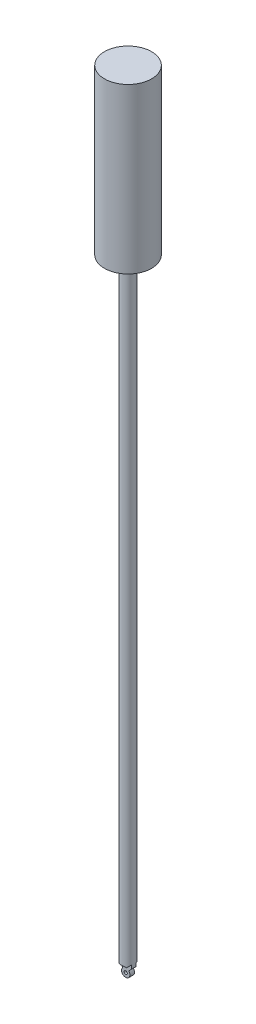
ISO-10303-21;
HEADER;
FILE_DESCRIPTION(('STEP AP214'),'2;1');
FILE_NAME('part.step','',(''),(''),'','','');
FILE_SCHEMA(('AUTOMOTIVE_DESIGN { 1 0 10303 214 1 1 1 1 }'));
ENDSEC;
DATA;
#1=APPLICATION_CONTEXT('core data for automotive mechanical design processes');
#2=APPLICATION_PROTOCOL_DEFINITION('international standard','automotive_design',2000,#1);
#3=PRODUCT_CONTEXT('',#1,'mechanical');
#4=PRODUCT('Part','Part','',(#3));
#5=PRODUCT_RELATED_PRODUCT_CATEGORY('part','',(#4));
#6=PRODUCT_DEFINITION_FORMATION('','',#4);
#7=PRODUCT_DEFINITION_CONTEXT('part definition',#1,'design');
#8=PRODUCT_DEFINITION('design','',#6,#7);
#9=PRODUCT_DEFINITION_SHAPE('','',#8);
#10=(LENGTH_UNIT() NAMED_UNIT(*) SI_UNIT(.MILLI.,.METRE.));
#11=(NAMED_UNIT(*) PLANE_ANGLE_UNIT() SI_UNIT($,.RADIAN.));
#12=(NAMED_UNIT(*) SI_UNIT($,.STERADIAN.) SOLID_ANGLE_UNIT());
#13=UNCERTAINTY_MEASURE_WITH_UNIT(LENGTH_MEASURE(1.E-05),#10,'distance_accuracy_value','');
#14=(GEOMETRIC_REPRESENTATION_CONTEXT(3) GLOBAL_UNCERTAINTY_ASSIGNED_CONTEXT((#13)) GLOBAL_UNIT_ASSIGNED_CONTEXT((#10,
#11,#12)) REPRESENTATION_CONTEXT('',''));
#15=CARTESIAN_POINT('',(0.,0.,0.));
#16=DIRECTION('',(0.,0.,1.));
#17=DIRECTION('',(1.,0.,0.));
#18=AXIS2_PLACEMENT_3D('',#15,#16,#17);
#19=CARTESIAN_POINT('',(0.,-20.,0.));
#20=DIRECTION('',(0.,1.,0.));
#21=DIRECTION('',(-1.,0.,0.));
#22=AXIS2_PLACEMENT_3D('',#19,#20,#21);
#23=CYLINDRICAL_SURFACE('',#22,4.);
#24=CARTESIAN_POINT('',(0.,-17.6666686049084,0.));
#25=DIRECTION('',(0.707106781186582,0.707106781186513,0.));
#26=DIRECTION('',(-0.707106781186513,0.707106781186582,0.));
#27=AXIS2_PLACEMENT_3D('',#24,#25,#26);
#28=ELLIPSE('',#27,5.65685424949266,4.);
#29=CARTESIAN_POINT('',(-3.72141018671348,-13.9452584181946,-1.466665));
#30=VERTEX_POINT('',#29);
#31=CARTESIAN_POINT('',(-2.35755264134601,-15.3091159635622,-3.23139993552057));
#32=VERTEX_POINT('',#31);
#33=EDGE_CURVE('E11',#30,#32,#28,.F.);
#34=ORIENTED_EDGE('',*,*,#33,.F.);
#35=DIRECTION('',(0.,1.,0.));
#36=VECTOR('',#35,1.);
#37=CARTESIAN_POINT('',(-3.72141018671347,-20.,-1.466665));
#38=LINE('',#37,#36);
#39=CARTESIAN_POINT('',(-3.72141018671345,-16.2785894181945,-1.466665));
#40=VERTEX_POINT('',#39);
#41=EDGE_CURVE('E130',#30,#40,#38,.F.);
#42=ORIENTED_EDGE('',*,*,#41,.T.);
#43=CARTESIAN_POINT('',(0.,-19.999999604908,0.));
#44=DIRECTION('',(0.707106781186548,0.707106781186547,0.));
#45=DIRECTION('',(-0.707106781186547,0.707106781186548,0.));
#46=AXIS2_PLACEMENT_3D('',#43,#44,#45);
#47=ELLIPSE('',#46,5.65685424949239,4.);
#48=CARTESIAN_POINT('',(-3.72141018671347,-16.2785894181945,1.466665));
#49=VERTEX_POINT('',#48);
#50=EDGE_CURVE('E177',#49,#40,#47,.F.);
#51=ORIENTED_EDGE('',*,*,#50,.F.);
#52=DIRECTION('',(0.,1.,0.));
#53=VECTOR('',#52,1.);
#54=CARTESIAN_POINT('',(-3.72141018671347,-20.,1.466665));
#55=LINE('',#54,#53);
#56=CARTESIAN_POINT('',(-3.72141018671348,-13.9452584181946,1.466665));
#57=VERTEX_POINT('',#56);
#58=EDGE_CURVE('E49',#49,#57,#55,.T.);
#59=ORIENTED_EDGE('',*,*,#58,.T.);
#60=CARTESIAN_POINT('',(0.,-17.6666686049084,0.));
#61=DIRECTION('',(-0.707106781186582,-0.707106781186513,0.));
#62=DIRECTION('',(-0.707106781186513,0.707106781186582,0.));
#63=AXIS2_PLACEMENT_3D('',#60,#61,#62);
#64=ELLIPSE('',#63,5.65685424949266,4.);
#65=CARTESIAN_POINT('',(-2.35755264134601,-15.3091159635622,3.23139993552057));
#66=VERTEX_POINT('',#65);
#67=EDGE_CURVE('E185',#57,#66,#64,.F.);
#68=ORIENTED_EDGE('',*,*,#67,.T.);
#69=CARTESIAN_POINT('',(-2.35755264134601,-15.3091159635622,3.23139993552057));
#70=CARTESIAN_POINT('',(-2.28018477029187,-15.2702245522524,3.2878467518568));
#71=CARTESIAN_POINT('',(-2.20037255193903,-15.2325178433075,3.34181663122735));
#72=CARTESIAN_POINT('',(-2.03601236884009,-15.1600458296973,3.44442259321851));
#73=CARTESIAN_POINT('',(-1.95146027702996,-15.1252831566858,3.49305391500256));
#74=CARTESIAN_POINT('',(-1.77735990259457,-15.0591327826377,3.58479183254059));
#75=CARTESIAN_POINT('',(-1.68778330091307,-15.0277679169173,3.62786138128199));
#76=CARTESIAN_POINT('',(-1.50451563254694,-14.9692816422629,3.70761593930542));
#77=CARTESIAN_POINT('',(-1.41082564137398,-14.9421591324599,3.74430260519047));
#78=CARTESIAN_POINT('',(-1.21923701871661,-14.8925784155484,3.81101146719209));
#79=CARTESIAN_POINT('',(-1.12131690671836,-14.870148528965,3.84099326949131));
#80=CARTESIAN_POINT('',(-0.92244737243638,-14.8306856032384,3.89354146584116));
#81=CARTESIAN_POINT('',(-0.821498324494044,-14.8136519001724,3.91610877215157));
#82=CARTESIAN_POINT('',(-0.617684054783718,-14.7854565902768,3.95337368822952));
#83=CARTESIAN_POINT('',(-0.514825986121909,-14.7742763949892,3.96809621263827));
#84=CARTESIAN_POINT('',(-0.307803756713248,-14.7580079847133,3.98949640744376));
#85=CARTESIAN_POINT('',(-0.203639773324103,-14.752918951343,3.99617515856764));
#86=CARTESIAN_POINT('',(-0.00595540862767157,-14.7491775055303,4.00108618841533));
#87=CARTESIAN_POINT('',(0.0875343906052204,-14.7499054728652,4.00013155816628));
#88=CARTESIAN_POINT('',(0.274077986535251,-14.7563332143547,3.99169154357499));
#89=CARTESIAN_POINT('',(0.367131631449622,-14.7620346063419,3.98420403411657));
#90=CARTESIAN_POINT('',(0.552114801363084,-14.7782915939085,3.96280710190654));
#91=CARTESIAN_POINT('',(0.64404376015586,-14.7888495389203,3.94889457093891));
#92=CARTESIAN_POINT('',(0.826099627047839,-14.8145900474948,3.91486270094267));
#93=CARTESIAN_POINT('',(0.916225848177409,-14.8297743395436,3.89474104203686));
#94=CARTESIAN_POINT('',(1.17815623347757,-14.8808814825838,3.82672517404508));
#95=CARTESIAN_POINT('',(1.34671694593059,-14.9228473316024,3.77054859065809));
#96=CARTESIAN_POINT('',(1.67145657144918,-15.020293387619,3.63827240859034));
#97=CARTESIAN_POINT('',(1.8276380908952,-15.0757707397624,3.56217701831415));
#98=CARTESIAN_POINT('',(2.04310281497984,-15.1633343512534,3.43970624959556));
#99=CARTESIAN_POINT('',(2.10811602300689,-15.1913438616972,3.40023310316015));
#100=CARTESIAN_POINT('',(2.23508626926058,-15.2490335564896,3.31814422581291));
#101=CARTESIAN_POINT('',(2.29705079327871,-15.2787092216106,3.27553690689552));
#102=CARTESIAN_POINT('',(2.35755264134573,-15.309115963562,3.23139993552081));
#103=B_SPLINE_CURVE_WITH_KNOTS('',3,(#69,#70,#71,#72,#73,#74,#75,#76,#77,#78,#79,#80,#81,#82,
#83,#84,#85,#86,#87,#88,#89,#90,#91,#92,#93,#94,#95,#96,#97,#98,#99,#100,#101,#102),
.UNSPECIFIED.,.F.,.F.,(4,2,2,2,2,2,2,2,2,2,2,2,2,2,2,2,4),(0.,0.310080225500508,
0.620434766677422,0.932760264622766,1.24500458080203,1.5590821791133,1.87312111967167,
2.18615665181655,2.4991501211466,2.77928617866823,3.05951339717674,3.33987632271977,
3.62034412558001,4.16567717972672,4.71089510989294,4.95394024821133,5.19635532519679),.UNSPECIFIED.);
#104=CARTESIAN_POINT('',(2.35755264134573,-15.309115963562,3.23139993552081));
#105=VERTEX_POINT('',#104);
#106=EDGE_CURVE('E57',#66,#105,#103,.T.);
#107=ORIENTED_EDGE('',*,*,#106,.T.);
#108=CARTESIAN_POINT('',(0.,-17.6666686049075,0.));
#109=DIRECTION('',(0.707106781186513,-0.707106781186582,0.));
#110=DIRECTION('',(0.707106781186582,0.707106781186513,0.));
#111=AXIS2_PLACEMENT_3D('',#108,#109,#110);
#112=ELLIPSE('',#111,5.6568542494921,4.);
#113=CARTESIAN_POINT('',(3.72141018671352,-13.9452584181944,1.466665));
#114=VERTEX_POINT('',#113);
#115=EDGE_CURVE('E192',#105,#114,#112,.F.);
#116=ORIENTED_EDGE('',*,*,#115,.T.);
#117=DIRECTION('',(0.,1.,0.));
#118=VECTOR('',#117,1.);
#119=CARTESIAN_POINT('',(3.72141018671352,-20.,1.466665));
#120=LINE('',#119,#118);
#121=CARTESIAN_POINT('',(3.72141018671352,-16.2785894181944,1.466665));
#122=VERTEX_POINT('',#121);
#123=EDGE_CURVE('E166',#114,#122,#120,.F.);
#124=ORIENTED_EDGE('',*,*,#123,.T.);
#125=CARTESIAN_POINT('',(0.,-19.9999996049079,0.));
#126=DIRECTION('',(-0.707106781186548,0.707106781186548,0.));
#127=DIRECTION('',(0.707106781186548,0.707106781186548,0.));
#128=AXIS2_PLACEMENT_3D('',#125,#126,#127);
#129=ELLIPSE('',#128,5.65685424949238,4.);
#130=CARTESIAN_POINT('',(3.72141018671352,-16.2785894181944,-1.466665));
#131=VERTEX_POINT('',#130);
#132=EDGE_CURVE('E181',#131,#122,#129,.F.);
#133=ORIENTED_EDGE('',*,*,#132,.F.);
#134=DIRECTION('',(0.,1.,0.));
#135=VECTOR('',#134,1.);
#136=CARTESIAN_POINT('',(3.72141018671352,-20.,-1.466665));
#137=LINE('',#136,#135);
#138=CARTESIAN_POINT('',(3.72141018671352,-13.9452584181944,-1.466665));
#139=VERTEX_POINT('',#138);
#140=EDGE_CURVE('E121',#131,#139,#137,.T.);
#141=ORIENTED_EDGE('',*,*,#140,.T.);
#142=CARTESIAN_POINT('',(0.,-17.6666686049075,0.));
#143=DIRECTION('',(-0.707106781186513,0.707106781186582,0.));
#144=DIRECTION('',(0.707106781186582,0.707106781186513,0.));
#145=AXIS2_PLACEMENT_3D('',#142,#143,#144);
#146=ELLIPSE('',#145,5.6568542494921,4.);
#147=CARTESIAN_POINT('',(2.35755264134573,-15.309115963562,-3.23139993552081));
#148=VERTEX_POINT('',#147);
#149=EDGE_CURVE('E232',#148,#139,#146,.F.);
#150=ORIENTED_EDGE('',*,*,#149,.F.);
#151=CARTESIAN_POINT('',(-2.35755264134601,-15.3091159635622,-3.23139993552057));
#152=CARTESIAN_POINT('',(-2.28018477029187,-15.2702245522524,-3.2878467518568));
#153=CARTESIAN_POINT('',(-2.20037255193903,-15.2325178433075,-3.34181663122735));
#154=CARTESIAN_POINT('',(-2.03601236884009,-15.1600458296973,-3.44442259321851));
#155=CARTESIAN_POINT('',(-1.95146027702995,-15.1252831566858,-3.49305391500256));
#156=CARTESIAN_POINT('',(-1.77735990259457,-15.0591327826377,-3.58479183254059));
#157=CARTESIAN_POINT('',(-1.68778330091307,-15.0277679169173,-3.62786138128199));
#158=CARTESIAN_POINT('',(-1.50451563254694,-14.9692816422629,-3.70761593930542));
#159=CARTESIAN_POINT('',(-1.41082564137398,-14.9421591324599,-3.74430260519047));
#160=CARTESIAN_POINT('',(-1.21923701871661,-14.8925784155484,-3.81101146719209));
#161=CARTESIAN_POINT('',(-1.12131690671836,-14.870148528965,-3.84099326949131));
#162=CARTESIAN_POINT('',(-0.92244737243638,-14.8306856032384,-3.89354146584116));
#163=CARTESIAN_POINT('',(-0.821498324494044,-14.8136519001724,-3.91610877215157));
#164=CARTESIAN_POINT('',(-0.617684054783717,-14.7854565902768,-3.95337368822952));
#165=CARTESIAN_POINT('',(-0.514825986121908,-14.7742763949892,-3.96809621263827));
#166=CARTESIAN_POINT('',(-0.307803756713247,-14.7580079847133,-3.98949640744376));
#167=CARTESIAN_POINT('',(-0.203639773324103,-14.752918951343,-3.99617515856764));
#168=CARTESIAN_POINT('',(-0.00595540862767062,-14.7491775055303,-4.00108618841533));
#169=CARTESIAN_POINT('',(0.0875343906052212,-14.7499054728652,-4.00013155816628));
#170=CARTESIAN_POINT('',(0.274077986535251,-14.7563332143547,-3.99169154357499));
#171=CARTESIAN_POINT('',(0.367131631449622,-14.7620346063419,-3.98420403411657));
#172=CARTESIAN_POINT('',(0.552114801363085,-14.7782915939085,-3.96280710190654));
#173=CARTESIAN_POINT('',(0.64404376015586,-14.7888495389203,-3.94889457093891));
#174=CARTESIAN_POINT('',(0.82609962704784,-14.8145900474948,-3.91486270094267));
#175=CARTESIAN_POINT('',(0.916225848177409,-14.8297743395436,-3.89474104203686));
#176=CARTESIAN_POINT('',(1.17815623347757,-14.8808814825838,-3.82672517404508));
#177=CARTESIAN_POINT('',(1.34671694593059,-14.9228473316024,-3.77054859065809));
#178=CARTESIAN_POINT('',(1.67145657144918,-15.020293387619,-3.63827240859034));
#179=CARTESIAN_POINT('',(1.8276380908952,-15.0757707397624,-3.56217701831415));
#180=CARTESIAN_POINT('',(2.04310281497984,-15.1633343512534,-3.43970624959556));
#181=CARTESIAN_POINT('',(2.10811602300689,-15.1913438616972,-3.40023310316015));
#182=CARTESIAN_POINT('',(2.23508626926058,-15.2490335564896,-3.31814422581291));
#183=CARTESIAN_POINT('',(2.29705079327871,-15.2787092216106,-3.27553690689552));
#184=CARTESIAN_POINT('',(2.35755264134573,-15.309115963562,-3.23139993552081));
#185=B_SPLINE_CURVE_WITH_KNOTS('',3,(#151,#152,#153,#154,#155,#156,#157,#158,#159,#160,#161,
#162,#163,#164,#165,#166,#167,#168,#169,#170,#171,#172,#173,#174,#175,#176,#177,#178,#179,#180,
#181,#182,#183,#184),.UNSPECIFIED.,.F.,.F.,(4,2,2,2,2,2,2,2,2,2,2,2,2,2,2,2,4),(0.,
0.310080225500508,0.620434766677422,0.932760264622766,1.24500458080203,1.5590821791133,
1.87312111967167,2.18615665181655,2.4991501211466,2.77928617866823,3.05951339717674,
3.33987632271977,3.62034412558001,4.16567717972672,4.71089510989294,4.95394024821133,
5.19635532519679),.UNSPECIFIED.);
#186=EDGE_CURVE('E42',#32,#148,#185,.T.);
#187=ORIENTED_EDGE('',*,*,#186,.F.);
#188=EDGE_LOOP('',(#34,#42,#51,#59,#68,#107,#116,#124,#133,#141,#150,#187));
#189=FACE_BOUND('',#188,.T.);
#190=CARTESIAN_POINT('',(-1.83155134131754E-13,374.900000008,0.));
#191=DIRECTION('',(0.,1.,0.));
#192=DIRECTION('',(-1.,0.,0.));
#193=AXIS2_PLACEMENT_3D('',#190,#191,#192);
#194=CIRCLE('',#193,4.);
#195=CARTESIAN_POINT('',(-4.00000000000018,374.900000008,0.));
#196=VERTEX_POINT('',#195);
#197=EDGE_CURVE('E286',#196,#196,#194,.T.);
#198=ORIENTED_EDGE('',*,*,#197,.F.);
#199=EDGE_LOOP('',(#198));
#200=FACE_BOUND('',#199,.T.);
#201=ADVANCED_FACE('F33',(#189,#200),#23,.T.);
#202=CARTESIAN_POINT('',(0.,-20.,1.466665));
#203=DIRECTION('',(0.,0.,-1.));
#204=DIRECTION('',(-1.,0.,0.));
#205=AXIS2_PLACEMENT_3D('',#202,#203,#204);
#206=CYLINDRICAL_SURFACE('',#205,2.666664);
#207=DIRECTION('',(0.,0.,1.));
#208=VECTOR('',#207,1.);
#209=CARTESIAN_POINT('',(-1.885616,-18.114383604908,-10.));
#210=LINE('',#209,#208);
#211=CARTESIAN_POINT('',(-1.885616,-18.1143836049079,-1.466665));
#212=VERTEX_POINT('',#211);
#213=CARTESIAN_POINT('',(-1.885616,-18.1143836049079,1.466665));
#214=VERTEX_POINT('',#213);
#215=EDGE_CURVE('E169',#212,#214,#210,.T.);
#216=ORIENTED_EDGE('',*,*,#215,.F.);
#217=CARTESIAN_POINT('',(0.,-20.,-1.466665));
#218=DIRECTION('',(0.,0.,1.));
#219=DIRECTION('',(1.,0.,0.));
#220=AXIS2_PLACEMENT_3D('',#217,#218,#219);
#221=CIRCLE('',#220,2.666664);
#222=CARTESIAN_POINT('',(1.885616,-18.1143836049079,-1.466665));
#223=VERTEX_POINT('',#222);
#224=EDGE_CURVE('E172',#212,#223,#221,.T.);
#225=ORIENTED_EDGE('',*,*,#224,.T.);
#226=DIRECTION('',(0.,0.,1.));
#227=VECTOR('',#226,1.);
#228=CARTESIAN_POINT('',(1.885616,-18.1143836049079,-10.));
#229=LINE('',#228,#227);
#230=CARTESIAN_POINT('',(1.885616,-18.1143836049079,1.466665));
#231=VERTEX_POINT('',#230);
#232=EDGE_CURVE('E170',#223,#231,#229,.T.);
#233=ORIENTED_EDGE('',*,*,#232,.T.);
#234=CARTESIAN_POINT('',(0.,-20.,1.466665));
#235=DIRECTION('',(0.,0.,1.));
#236=DIRECTION('',(1.,0.,0.));
#237=AXIS2_PLACEMENT_3D('',#234,#235,#236);
#238=CIRCLE('',#237,2.666664);
#239=EDGE_CURVE('E174',#214,#231,#238,.T.);
#240=ORIENTED_EDGE('',*,*,#239,.F.);
#241=EDGE_LOOP('',(#216,#225,#233,#240));
#242=FACE_BOUND('',#241,.T.);
#243=ADVANCED_FACE('F210',(#242),#206,.T.);
#244=CARTESIAN_POINT('',(1.885616,-18.1143836049079,-10.));
#245=DIRECTION('',(-0.707106781186548,0.707106781186548,0.));
#246=DIRECTION('',(-0.707106781186548,-0.707106781186548,0.));
#247=AXIS2_PLACEMENT_3D('',#244,#245,#246);
#248=PLANE('',#247);
#249=DIRECTION('',(0.707106781186547,0.707106781186548,0.));
#250=VECTOR('',#249,1.);
#251=CARTESIAN_POINT('',(3.99999999999999,-15.9999996049079,-1.466665));
#252=LINE('',#251,#250);
#253=EDGE_CURVE('E137',#223,#131,#252,.T.);
#254=ORIENTED_EDGE('',*,*,#253,.T.);
#255=ORIENTED_EDGE('',*,*,#132,.T.);
#256=DIRECTION('',(0.707106781186547,0.707106781186548,0.));
#257=VECTOR('',#256,1.);
#258=CARTESIAN_POINT('',(3.99999999999999,-15.9999996049079,1.466665));
#259=LINE('',#258,#257);
#260=EDGE_CURVE('E150',#231,#122,#259,.T.);
#261=ORIENTED_EDGE('',*,*,#260,.F.);
#262=ORIENTED_EDGE('',*,*,#232,.F.);
#263=EDGE_LOOP('',(#254,#255,#261,#262));
#264=FACE_BOUND('',#263,.T.);
#265=ADVANCED_FACE('F206',(#264),#248,.F.);
#266=CARTESIAN_POINT('',(-1.885616,-18.114383604908,-10.));
#267=DIRECTION('',(0.707106781186548,0.707106781186547,0.));
#268=DIRECTION('',(-0.707106781186547,0.707106781186548,0.));
#269=AXIS2_PLACEMENT_3D('',#266,#267,#268);
#270=PLANE('',#269);
#271=DIRECTION('',(0.707106781186548,-0.707106781186547,0.));
#272=VECTOR('',#271,1.);
#273=CARTESIAN_POINT('',(-4.00000000000001,-15.9999996049079,-1.466665));
#274=LINE('',#273,#272);
#275=EDGE_CURVE('E143',#40,#212,#274,.T.);
#276=ORIENTED_EDGE('',*,*,#275,.T.);
#277=ORIENTED_EDGE('',*,*,#215,.T.);
#278=DIRECTION('',(0.707106781186547,-0.707106781186548,0.));
#279=VECTOR('',#278,1.);
#280=CARTESIAN_POINT('',(-1.885616,-18.114383604908,1.466665));
#281=LINE('',#280,#279);
#282=EDGE_CURVE('E183',#49,#214,#281,.T.);
#283=ORIENTED_EDGE('',*,*,#282,.F.);
#284=ORIENTED_EDGE('',*,*,#50,.T.);
#285=EDGE_LOOP('',(#276,#277,#283,#284));
#286=FACE_BOUND('',#285,.T.);
#287=ADVANCED_FACE('F209',(#286),#270,.F.);
#288=CARTESIAN_POINT('',(0.,-20.,1.466665));
#289=DIRECTION('',(0.,0.,1.));
#290=DIRECTION('',(1.,0.,0.));
#291=AXIS2_PLACEMENT_3D('',#288,#289,#290);
#292=PLANE('',#291);
#293=CARTESIAN_POINT('',(0.,-20.,1.466665));
#294=DIRECTION('',(0.,0.,1.));
#295=DIRECTION('',(1.,0.,0.));
#296=AXIS2_PLACEMENT_3D('',#293,#294,#295);
#297=CIRCLE('',#296,0.9916668);
#298=CARTESIAN_POINT('',(0.991666800000025,-20.,1.466665));
#299=VERTEX_POINT('',#298);
#300=EDGE_CURVE('E290',#299,#299,#297,.T.);
#301=ORIENTED_EDGE('',*,*,#300,.F.);
#302=EDGE_LOOP('',(#301));
#303=FACE_BOUND('',#302,.T.);
#304=ORIENTED_EDGE('',*,*,#239,.T.);
#305=ORIENTED_EDGE('',*,*,#260,.T.);
#306=ORIENTED_EDGE('',*,*,#123,.F.);
#307=DIRECTION('',(-0.707106781186582,-0.707106781186513,0.));
#308=VECTOR('',#307,1.);
#309=CARTESIAN_POINT('',(2.35755264134573,-15.309115963562,1.466665));
#310=LINE('',#309,#308);
#311=CARTESIAN_POINT('',(2.35755264134573,-15.309115963562,1.466665));
#312=VERTEX_POINT('',#311);
#313=EDGE_CURVE('E153',#114,#312,#310,.T.);
#314=ORIENTED_EDGE('',*,*,#313,.T.);
#315=CARTESIAN_POINT('',(0.,-20.,1.466665));
#316=DIRECTION('',(0.,0.,1.));
#317=DIRECTION('',(-1.,0.,0.));
#318=AXIS2_PLACEMENT_3D('',#315,#316,#317);
#319=CIRCLE('',#318,5.249995);
#320=CARTESIAN_POINT('',(-2.35755264134601,-15.3091159635622,1.466665));
#321=VERTEX_POINT('',#320);
#322=EDGE_CURVE('E156',#312,#321,#319,.T.);
#323=ORIENTED_EDGE('',*,*,#322,.T.);
#324=DIRECTION('',(-0.707106781186513,0.707106781186582,0.));
#325=VECTOR('',#324,1.);
#326=CARTESIAN_POINT('',(-4.00000000000011,-13.6666686049079,1.466665));
#327=LINE('',#326,#325);
#328=EDGE_CURVE('E159',#321,#57,#327,.T.);
#329=ORIENTED_EDGE('',*,*,#328,.T.);
#330=ORIENTED_EDGE('',*,*,#58,.F.);
#331=ORIENTED_EDGE('',*,*,#282,.T.);
#332=EDGE_LOOP('',(#304,#305,#306,#314,#323,#329,#330,#331));
#333=FACE_BOUND('',#332,.T.);
#334=ADVANCED_FACE('F214',(#303,#333),#292,.T.);
#335=CARTESIAN_POINT('',(0.,-20.,-1.466665));
#336=DIRECTION('',(0.,0.,1.));
#337=DIRECTION('',(1.,0.,0.));
#338=AXIS2_PLACEMENT_3D('',#335,#336,#337);
#339=PLANE('',#338);
#340=CARTESIAN_POINT('',(0.,-20.,-1.466665));
#341=DIRECTION('',(0.,0.,1.));
#342=DIRECTION('',(1.,0.,0.));
#343=AXIS2_PLACEMENT_3D('',#340,#341,#342);
#344=CIRCLE('',#343,0.9916668);
#345=CARTESIAN_POINT('',(0.991666800000025,-20.,-1.466665));
#346=VERTEX_POINT('',#345);
#347=EDGE_CURVE('E37',#346,#346,#344,.T.);
#348=ORIENTED_EDGE('',*,*,#347,.T.);
#349=EDGE_LOOP('',(#348));
#350=FACE_BOUND('',#349,.T.);
#351=ORIENTED_EDGE('',*,*,#224,.F.);
#352=ORIENTED_EDGE('',*,*,#275,.F.);
#353=ORIENTED_EDGE('',*,*,#41,.F.);
#354=DIRECTION('',(-0.707106781186513,0.707106781186582,0.));
#355=VECTOR('',#354,1.);
#356=CARTESIAN_POINT('',(-4.00000000000011,-13.6666686049079,-1.466665));
#357=LINE('',#356,#355);
#358=CARTESIAN_POINT('',(-2.35755264134601,-15.3091159635622,-1.466665));
#359=VERTEX_POINT('',#358);
#360=EDGE_CURVE('E117',#359,#30,#357,.T.);
#361=ORIENTED_EDGE('',*,*,#360,.F.);
#362=CARTESIAN_POINT('',(0.,-20.,-1.466665));
#363=DIRECTION('',(0.,0.,1.));
#364=DIRECTION('',(-1.,0.,0.));
#365=AXIS2_PLACEMENT_3D('',#362,#363,#364);
#366=CIRCLE('',#365,5.249995);
#367=CARTESIAN_POINT('',(2.35755264134573,-15.309115963562,-1.466665));
#368=VERTEX_POINT('',#367);
#369=EDGE_CURVE('E128',#368,#359,#366,.T.);
#370=ORIENTED_EDGE('',*,*,#369,.F.);
#371=DIRECTION('',(-0.707106781186582,-0.707106781186513,0.));
#372=VECTOR('',#371,1.);
#373=CARTESIAN_POINT('',(2.35755264134573,-15.309115963562,-1.466665));
#374=LINE('',#373,#372);
#375=EDGE_CURVE('E135',#139,#368,#374,.T.);
#376=ORIENTED_EDGE('',*,*,#375,.F.);
#377=ORIENTED_EDGE('',*,*,#140,.F.);
#378=ORIENTED_EDGE('',*,*,#253,.F.);
#379=EDGE_LOOP('',(#351,#352,#353,#361,#370,#376,#377,#378));
#380=FACE_BOUND('',#379,.T.);
#381=ADVANCED_FACE('F126',(#350,#380),#339,.F.);
#382=CARTESIAN_POINT('',(2.35755264134573,-15.309115963562,4.));
#383=DIRECTION('',(0.707106781186513,-0.707106781186582,0.));
#384=DIRECTION('',(0.707106781186582,0.707106781186513,0.));
#385=AXIS2_PLACEMENT_3D('',#382,#383,#384);
#386=PLANE('',#385);
#387=DIRECTION('',(0.,0.,-1.));
#388=VECTOR('',#387,1.);
#389=CARTESIAN_POINT('',(2.35755264134573,-15.309115963562,4.));
#390=LINE('',#389,#388);
#391=EDGE_CURVE('E163',#105,#312,#390,.T.);
#392=ORIENTED_EDGE('',*,*,#391,.T.);
#393=ORIENTED_EDGE('',*,*,#313,.F.);
#394=ORIENTED_EDGE('',*,*,#115,.F.);
#395=EDGE_LOOP('',(#392,#393,#394));
#396=FACE_BOUND('',#395,.T.);
#397=ADVANCED_FACE('F200',(#396),#386,.T.);
#398=CARTESIAN_POINT('',(0.,-20.,4.));
#399=DIRECTION('',(0.,0.,-1.));
#400=DIRECTION('',(-1.,0.,0.));
#401=AXIS2_PLACEMENT_3D('',#398,#399,#400);
#402=CYLINDRICAL_SURFACE('',#401,5.249995);
#403=DIRECTION('',(0.,0.,-1.));
#404=VECTOR('',#403,1.);
#405=CARTESIAN_POINT('',(-2.35755264134601,-15.3091159635622,4.));
#406=LINE('',#405,#404);
#407=EDGE_CURVE('E161',#66,#321,#406,.T.);
#408=ORIENTED_EDGE('',*,*,#407,.T.);
#409=ORIENTED_EDGE('',*,*,#322,.F.);
#410=ORIENTED_EDGE('',*,*,#391,.F.);
#411=ORIENTED_EDGE('',*,*,#106,.F.);
#412=EDGE_LOOP('',(#408,#409,#410,#411));
#413=FACE_BOUND('',#412,.T.);
#414=ADVANCED_FACE('F194',(#413),#402,.F.);
#415=CARTESIAN_POINT('',(-4.00000000000011,-13.6666686049079,4.));
#416=DIRECTION('',(-0.707106781186582,-0.707106781186513,0.));
#417=DIRECTION('',(0.707106781186513,-0.707106781186582,0.));
#418=AXIS2_PLACEMENT_3D('',#415,#416,#417);
#419=PLANE('',#418);
#420=ORIENTED_EDGE('',*,*,#328,.F.);
#421=ORIENTED_EDGE('',*,*,#407,.F.);
#422=ORIENTED_EDGE('',*,*,#67,.F.);
#423=EDGE_LOOP('',(#420,#421,#422));
#424=FACE_BOUND('',#423,.T.);
#425=ADVANCED_FACE('F199',(#424),#419,.T.);
#426=CARTESIAN_POINT('',(-4.00000000000011,-13.6666686049079,-4.));
#427=DIRECTION('',(0.707106781186582,0.707106781186513,0.));
#428=DIRECTION('',(-0.707106781186513,0.707106781186582,0.));
#429=AXIS2_PLACEMENT_3D('',#426,#427,#428);
#430=PLANE('',#429);
#431=ORIENTED_EDGE('',*,*,#33,.T.);
#432=DIRECTION('',(0.,0.,1.));
#433=VECTOR('',#432,1.);
#434=CARTESIAN_POINT('',(-2.35755264134601,-15.3091159635622,-4.));
#435=LINE('',#434,#433);
#436=EDGE_CURVE('E114',#32,#359,#435,.T.);
#437=ORIENTED_EDGE('',*,*,#436,.T.);
#438=ORIENTED_EDGE('',*,*,#360,.T.);
#439=EDGE_LOOP('',(#431,#437,#438));
#440=FACE_BOUND('',#439,.T.);
#441=ADVANCED_FACE('F116',(#440),#430,.F.);
#442=CARTESIAN_POINT('',(0.,-20.,-4.));
#443=DIRECTION('',(0.,0.,1.));
#444=DIRECTION('',(1.,0.,0.));
#445=AXIS2_PLACEMENT_3D('',#442,#443,#444);
#446=CYLINDRICAL_SURFACE('',#445,5.249995);
#447=ORIENTED_EDGE('',*,*,#436,.F.);
#448=ORIENTED_EDGE('',*,*,#186,.T.);
#449=DIRECTION('',(0.,0.,1.));
#450=VECTOR('',#449,1.);
#451=CARTESIAN_POINT('',(2.35755264134573,-15.309115963562,-4.));
#452=LINE('',#451,#450);
#453=EDGE_CURVE('E122',#148,#368,#452,.T.);
#454=ORIENTED_EDGE('',*,*,#453,.T.);
#455=ORIENTED_EDGE('',*,*,#369,.T.);
#456=EDGE_LOOP('',(#447,#448,#454,#455));
#457=FACE_BOUND('',#456,.T.);
#458=ADVANCED_FACE('F132',(#457),#446,.F.);
#459=CARTESIAN_POINT('',(2.35755264134573,-15.309115963562,-4.));
#460=DIRECTION('',(-0.707106781186513,0.707106781186582,0.));
#461=DIRECTION('',(-0.707106781186582,-0.707106781186513,0.));
#462=AXIS2_PLACEMENT_3D('',#459,#460,#461);
#463=PLANE('',#462);
#464=ORIENTED_EDGE('',*,*,#149,.T.);
#465=ORIENTED_EDGE('',*,*,#375,.T.);
#466=ORIENTED_EDGE('',*,*,#453,.F.);
#467=EDGE_LOOP('',(#464,#465,#466));
#468=FACE_BOUND('',#467,.T.);
#469=ADVANCED_FACE('F241',(#468),#463,.F.);
#470=CARTESIAN_POINT('',(0.,-20.,-4.));
#471=DIRECTION('',(0.,0.,1.));
#472=DIRECTION('',(1.,0.,0.));
#473=AXIS2_PLACEMENT_3D('',#470,#471,#472);
#474=CYLINDRICAL_SURFACE('',#473,0.9916668);
#475=ORIENTED_EDGE('',*,*,#300,.T.);
#476=EDGE_LOOP('',(#475));
#477=FACE_BOUND('',#476,.T.);
#478=ORIENTED_EDGE('',*,*,#347,.F.);
#479=EDGE_LOOP('',(#478));
#480=FACE_BOUND('',#479,.T.);
#481=ADVANCED_FACE('F260',(#477,#480),#474,.F.);
#482=CARTESIAN_POINT('',(-2.38248008838484E-13,479.370000008,0.));
#483=DIRECTION('',(0.,-1.,0.));
#484=DIRECTION('',(1.,0.,0.));
#485=AXIS2_PLACEMENT_3D('',#482,#483,#484);
#486=CYLINDRICAL_SURFACE('',#485,15.);
#487=CARTESIAN_POINT('',(-2.38248008838484E-13,479.370000008,0.));
#488=DIRECTION('',(0.,1.,0.));
#489=DIRECTION('',(-1.,0.,0.));
#490=AXIS2_PLACEMENT_3D('',#487,#488,#489);
#491=CIRCLE('',#490,15.);
#492=CARTESIAN_POINT('',(14.9999999999998,479.370000008,0.));
#493=VERTEX_POINT('',#492);
#494=EDGE_CURVE('E285',#493,#493,#491,.T.);
#495=CARTESIAN_POINT('',(-1.83155134131754E-13,374.900000008,0.));
#496=DIRECTION('',(0.,1.,0.));
#497=DIRECTION('',(-1.,0.,0.));
#498=AXIS2_PLACEMENT_3D('',#495,#496,#497);
#499=CIRCLE('',#498,15.);
#500=CARTESIAN_POINT('',(14.9999999999998,374.900000008,0.));
#501=VERTEX_POINT('',#500);
#502=EDGE_CURVE('E287',#501,#501,#499,.T.);
#503=CARTESIAN_POINT('',(14.9999999999998,479.370000008,0.));
#504=CARTESIAN_POINT('',(14.9999999999998,478.281770841333,0.));
#505=CARTESIAN_POINT('',(14.9999999999998,477.193541674667,0.));
#506=CARTESIAN_POINT('',(14.9999999999998,475.017083341333,0.));
#507=CARTESIAN_POINT('',(14.9999999999998,473.928854174667,0.));
#508=CARTESIAN_POINT('',(14.9999999999998,471.752395841333,0.));
#509=CARTESIAN_POINT('',(14.9999999999998,470.664166674667,0.));
#510=CARTESIAN_POINT('',(14.9999999999998,468.487708341333,0.));
#511=CARTESIAN_POINT('',(14.9999999999998,467.399479174667,0.));
#512=CARTESIAN_POINT('',(14.9999999999998,465.223020841333,0.));
#513=CARTESIAN_POINT('',(14.9999999999998,464.134791674667,0.));
#514=CARTESIAN_POINT('',(14.9999999999998,461.958333341333,0.));
#515=CARTESIAN_POINT('',(14.9999999999998,460.870104174667,0.));
#516=CARTESIAN_POINT('',(14.9999999999998,458.693645841333,0.));
#517=CARTESIAN_POINT('',(14.9999999999998,457.605416674667,0.));
#518=CARTESIAN_POINT('',(14.9999999999998,455.428958341333,0.));
#519=CARTESIAN_POINT('',(14.9999999999998,454.340729174667,0.));
#520=CARTESIAN_POINT('',(14.9999999999998,452.164270841333,0.));
#521=CARTESIAN_POINT('',(14.9999999999998,451.076041674667,0.));
#522=CARTESIAN_POINT('',(14.9999999999998,448.899583341333,0.));
#523=CARTESIAN_POINT('',(14.9999999999998,447.811354174667,0.));
#524=CARTESIAN_POINT('',(14.9999999999998,445.634895841333,0.));
#525=CARTESIAN_POINT('',(14.9999999999998,444.546666674667,0.));
#526=CARTESIAN_POINT('',(14.9999999999998,442.370208341333,0.));
#527=CARTESIAN_POINT('',(14.9999999999998,441.281979174667,0.));
#528=CARTESIAN_POINT('',(14.9999999999998,439.105520841333,0.));
#529=CARTESIAN_POINT('',(14.9999999999998,438.017291674667,0.));
#530=CARTESIAN_POINT('',(14.9999999999998,435.840833341333,0.));
#531=CARTESIAN_POINT('',(14.9999999999998,434.752604174667,0.));
#532=CARTESIAN_POINT('',(14.9999999999998,432.576145841333,0.));
#533=CARTESIAN_POINT('',(14.9999999999998,431.487916674667,0.));
#534=CARTESIAN_POINT('',(14.9999999999998,429.311458341333,0.));
#535=CARTESIAN_POINT('',(14.9999999999998,428.223229174667,0.));
#536=CARTESIAN_POINT('',(14.9999999999998,426.046770841333,0.));
#537=CARTESIAN_POINT('',(14.9999999999998,424.958541674667,0.));
#538=CARTESIAN_POINT('',(14.9999999999998,422.782083341333,0.));
#539=CARTESIAN_POINT('',(14.9999999999998,421.693854174667,0.));
#540=CARTESIAN_POINT('',(14.9999999999998,419.517395841333,0.));
#541=CARTESIAN_POINT('',(14.9999999999998,418.429166674667,0.));
#542=CARTESIAN_POINT('',(14.9999999999998,416.252708341333,0.));
#543=CARTESIAN_POINT('',(14.9999999999998,415.164479174667,0.));
#544=CARTESIAN_POINT('',(14.9999999999998,412.988020841333,0.));
#545=CARTESIAN_POINT('',(14.9999999999998,411.899791674667,0.));
#546=CARTESIAN_POINT('',(14.9999999999998,409.723333341333,0.));
#547=CARTESIAN_POINT('',(14.9999999999998,408.635104174667,0.));
#548=CARTESIAN_POINT('',(14.9999999999998,406.458645841333,0.));
#549=CARTESIAN_POINT('',(14.9999999999998,405.370416674667,0.));
#550=CARTESIAN_POINT('',(14.9999999999998,403.193958341333,0.));
#551=CARTESIAN_POINT('',(14.9999999999998,402.105729174667,0.));
#552=CARTESIAN_POINT('',(14.9999999999998,399.929270841333,0.));
#553=CARTESIAN_POINT('',(14.9999999999998,398.841041674667,0.));
#554=CARTESIAN_POINT('',(14.9999999999998,396.664583341333,0.));
#555=CARTESIAN_POINT('',(14.9999999999998,395.576354174667,0.));
#556=CARTESIAN_POINT('',(14.9999999999998,393.399895841333,0.));
#557=CARTESIAN_POINT('',(14.9999999999998,392.311666674667,0.));
#558=CARTESIAN_POINT('',(14.9999999999998,390.135208341333,0.));
#559=CARTESIAN_POINT('',(14.9999999999998,389.046979174667,0.));
#560=CARTESIAN_POINT('',(14.9999999999998,386.870520841333,0.));
#561=CARTESIAN_POINT('',(14.9999999999998,385.782291674667,0.));
#562=CARTESIAN_POINT('',(14.9999999999998,383.605833341333,0.));
#563=CARTESIAN_POINT('',(14.9999999999998,382.517604174667,0.));
#564=CARTESIAN_POINT('',(14.9999999999998,380.341145841333,0.));
#565=CARTESIAN_POINT('',(14.9999999999998,379.252916674667,0.));
#566=CARTESIAN_POINT('',(14.9999999999998,377.076458341333,0.));
#567=CARTESIAN_POINT('',(14.9999999999998,375.988229174667,0.));
#568=CARTESIAN_POINT('',(14.9999999999998,374.900000008,0.));
#569=B_SPLINE_CURVE_WITH_KNOTS('',3,(#503,#504,#505,#506,#507,#508,#509,#510,#511,#512,#513,
#514,#515,#516,#517,#518,#519,#520,#521,#522,#523,#524,#525,#526,#527,#528,#529,#530,#531,#532,
#533,#534,#535,#536,#537,#538,#539,#540,#541,#542,#543,#544,#545,#546,#547,#548,#549,#550,#551,
#552,#553,#554,#555,#556,#557,#558,#559,#560,#561,#562,#563,#564,#565,#566,#567,#568),
.UNSPECIFIED.,.F.,.F.,(4,2,2,2,2,2,2,2,2,2,2,2,2,2,2,2,2,2,2,2,2,2,2,2,2,2,2,2,2,2,2,2,4),(0.,
3.26468749999997,6.52937499999995,9.79406249999998,13.05875,16.3234375,19.588125,22.8528125,
26.1175,29.3821875,32.646875,35.9115625,39.17625,42.4409375,45.705625,48.9703125,52.235,
55.4996875,58.764375,62.0290625,65.29375,68.5584375,71.823125,75.0878125,78.3525,81.6171875,
84.881875,88.1465625,91.41125,94.6759375,97.940625,101.2053125,104.47),.UNSPECIFIED.);
#570=EDGE_CURVE('BSEAM264',#493,#501,#569,.T.);
#571=ORIENTED_EDGE('',*,*,#494,.F.);
#572=ORIENTED_EDGE('',*,*,#502,.T.);
#573=ORIENTED_EDGE('',*,*,#570,.T.);
#574=ORIENTED_EDGE('',*,*,#570,.F.);
#575=EDGE_LOOP('',(#571,#573,#572,#574));
#576=FACE_BOUND('',#575,.T.);
#577=ADVANCED_FACE('F264',(#576),#486,.T.);
#578=CARTESIAN_POINT('',(-2.38248008838484E-13,479.370000008,0.));
#579=DIRECTION('',(0.,1.,0.));
#580=DIRECTION('',(-1.,0.,0.));
#581=AXIS2_PLACEMENT_3D('',#578,#579,#580);
#582=PLANE('',#581);
#583=ORIENTED_EDGE('',*,*,#494,.T.);
#584=EDGE_LOOP('',(#583));
#585=FACE_BOUND('',#584,.T.);
#586=ADVANCED_FACE('F269',(#585),#582,.T.);
#587=CARTESIAN_POINT('',(-1.83155134131754E-13,374.900000008,0.));
#588=DIRECTION('',(0.,1.,0.));
#589=DIRECTION('',(-1.,0.,0.));
#590=AXIS2_PLACEMENT_3D('',#587,#588,#589);
#591=PLANE('',#590);
#592=ORIENTED_EDGE('',*,*,#197,.T.);
#593=EDGE_LOOP('',(#592));
#594=FACE_BOUND('',#593,.T.);
#595=ORIENTED_EDGE('',*,*,#502,.F.);
#596=EDGE_LOOP('',(#595));
#597=FACE_BOUND('',#596,.T.);
#598=ADVANCED_FACE('F275',(#594,#597),#591,.F.);
#599=CLOSED_SHELL('',(#201,#243,#265,#287,#334,#381,#397,#414,#425,#441,#458,#469,#481,#577,
#586,#598));
#600=MANIFOLD_SOLID_BREP('B2',#599);
#601=ADVANCED_BREP_SHAPE_REPRESENTATION('',(#18,#600),#14);
#602=SHAPE_DEFINITION_REPRESENTATION(#9,#601);
ENDSEC;
END-ISO-10303-21;
